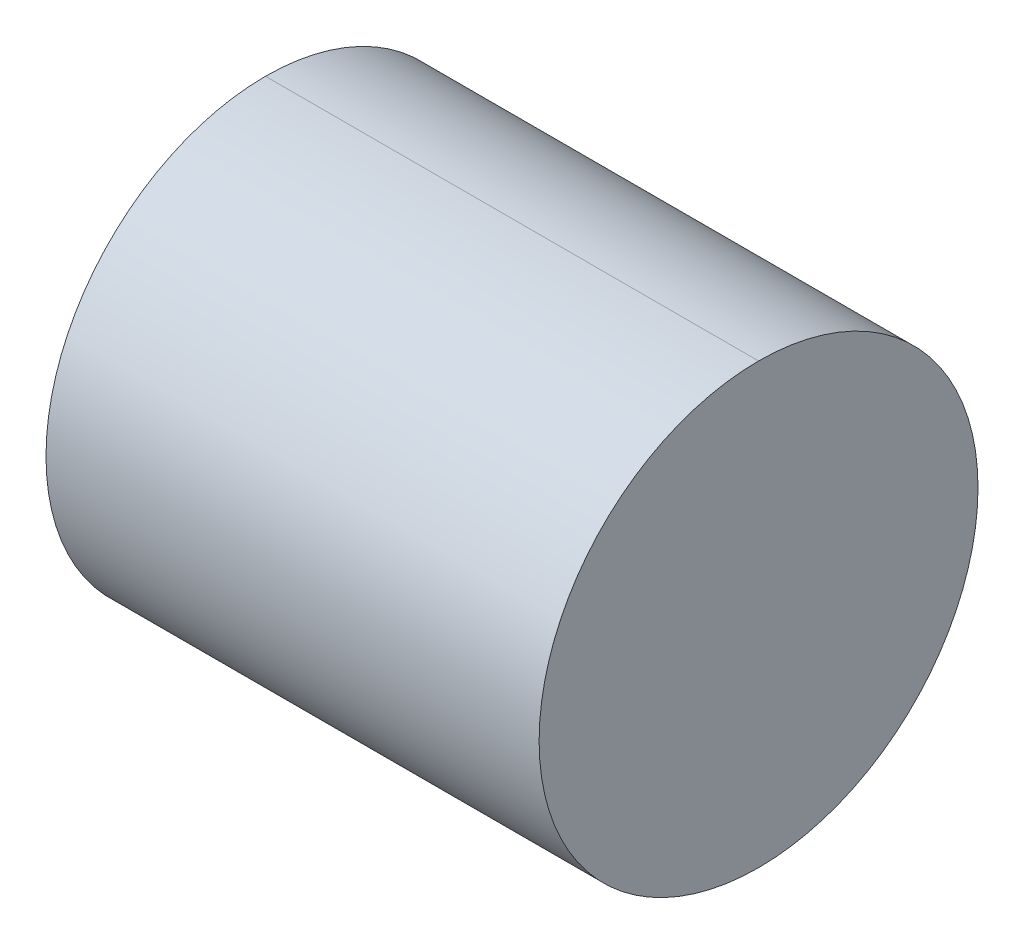
ISO-10303-21;
HEADER;
FILE_DESCRIPTION(('STEP AP214'),'2;1');
FILE_NAME('part.step','',(''),(''),'','','');
FILE_SCHEMA(('AUTOMOTIVE_DESIGN { 1 0 10303 214 1 1 1 1 }'));
ENDSEC;
DATA;
#1=APPLICATION_CONTEXT('core data for automotive mechanical design processes');
#2=APPLICATION_PROTOCOL_DEFINITION('international standard','automotive_design',2000,#1);
#3=PRODUCT_CONTEXT('',#1,'mechanical');
#4=PRODUCT('Part','Part','',(#3));
#5=PRODUCT_RELATED_PRODUCT_CATEGORY('part','',(#4));
#6=PRODUCT_DEFINITION_FORMATION('','',#4);
#7=PRODUCT_DEFINITION_CONTEXT('part definition',#1,'design');
#8=PRODUCT_DEFINITION('design','',#6,#7);
#9=PRODUCT_DEFINITION_SHAPE('','',#8);
#10=(LENGTH_UNIT() NAMED_UNIT(*) SI_UNIT(.MILLI.,.METRE.));
#11=(NAMED_UNIT(*) PLANE_ANGLE_UNIT() SI_UNIT($,.RADIAN.));
#12=(NAMED_UNIT(*) SI_UNIT($,.STERADIAN.) SOLID_ANGLE_UNIT());
#13=UNCERTAINTY_MEASURE_WITH_UNIT(LENGTH_MEASURE(1.E-05),#10,'distance_accuracy_value','');
#14=(GEOMETRIC_REPRESENTATION_CONTEXT(3) GLOBAL_UNCERTAINTY_ASSIGNED_CONTEXT((#13)) GLOBAL_UNIT_ASSIGNED_CONTEXT((#10,
#11,#12)) REPRESENTATION_CONTEXT('',''));
#15=CARTESIAN_POINT('',(0.,0.,0.));
#16=DIRECTION('',(0.,0.,1.));
#17=DIRECTION('',(1.,0.,0.));
#18=AXIS2_PLACEMENT_3D('',#15,#16,#17);
#19=CARTESIAN_POINT('',(5.,0.,0.));
#20=DIRECTION('',(1.,0.,0.));
#21=DIRECTION('',(0.,1.,0.));
#22=AXIS2_PLACEMENT_3D('',#19,#20,#21);
#23=PLANE('',#22);
#24=CARTESIAN_POINT('',(5.,0.,0.));
#25=DIRECTION('',(1.,0.,0.));
#26=DIRECTION('',(0.,1.,0.));
#27=AXIS2_PLACEMENT_3D('',#24,#25,#26);
#28=CIRCLE('',#27,2.225);
#29=CARTESIAN_POINT('',(5.,2.225,0.));
#30=VERTEX_POINT('',#29);
#31=CARTESIAN_POINT('',(5.,-2.225,0.));
#32=VERTEX_POINT('',#31);
#33=EDGE_CURVE('E59',#30,#32,#28,.T.);
#34=ORIENTED_EDGE('',*,*,#33,.T.);
#35=CARTESIAN_POINT('',(5.,0.,0.));
#36=DIRECTION('',(1.,0.,0.));
#37=DIRECTION('',(0.,1.,0.));
#38=AXIS2_PLACEMENT_3D('',#35,#36,#37);
#39=CIRCLE('',#38,2.225);
#40=EDGE_CURVE('E11',#32,#30,#39,.T.);
#41=ORIENTED_EDGE('',*,*,#40,.T.);
#42=EDGE_LOOP('',(#34,#41));
#43=FACE_BOUND('',#42,.T.);
#44=ADVANCED_FACE('F16',(#43),#23,.T.);
#45=CARTESIAN_POINT('',(0.,0.,0.));
#46=DIRECTION('',(1.,0.,0.));
#47=DIRECTION('',(0.,1.,0.));
#48=AXIS2_PLACEMENT_3D('',#45,#46,#47);
#49=PLANE('',#48);
#50=CARTESIAN_POINT('',(0.,0.,0.));
#51=DIRECTION('',(1.,0.,0.));
#52=DIRECTION('',(0.,1.,0.));
#53=AXIS2_PLACEMENT_3D('',#50,#51,#52);
#54=CIRCLE('',#53,2.225);
#55=CARTESIAN_POINT('',(0.,-2.225,0.));
#56=VERTEX_POINT('',#55);
#57=CARTESIAN_POINT('',(0.,2.225,0.));
#58=VERTEX_POINT('',#57);
#59=EDGE_CURVE('E26',#56,#58,#54,.T.);
#60=ORIENTED_EDGE('',*,*,#59,.F.);
#61=CARTESIAN_POINT('',(0.,0.,0.));
#62=DIRECTION('',(1.,0.,0.));
#63=DIRECTION('',(0.,1.,0.));
#64=AXIS2_PLACEMENT_3D('',#61,#62,#63);
#65=CIRCLE('',#64,2.225);
#66=EDGE_CURVE('E19',#58,#56,#65,.T.);
#67=ORIENTED_EDGE('',*,*,#66,.F.);
#68=EDGE_LOOP('',(#60,#67));
#69=FACE_BOUND('',#68,.T.);
#70=ADVANCED_FACE('F61',(#69),#49,.F.);
#71=CARTESIAN_POINT('',(2.5,0.,0.));
#72=DIRECTION('',(1.,0.,0.));
#73=DIRECTION('',(0.,1.,0.));
#74=AXIS2_PLACEMENT_3D('',#71,#72,#73);
#75=CYLINDRICAL_SURFACE('',#74,2.225);
#76=DIRECTION('',(1.,0.,0.));
#77=VECTOR('',#76,1.);
#78=CARTESIAN_POINT('',(2.5,-2.225,0.));
#79=LINE('',#78,#77);
#80=EDGE_CURVE('E55',#56,#32,#79,.T.);
#81=ORIENTED_EDGE('',*,*,#80,.F.);
#82=ORIENTED_EDGE('',*,*,#59,.T.);
#83=DIRECTION('',(1.,0.,0.));
#84=VECTOR('',#83,1.);
#85=CARTESIAN_POINT('',(2.5,2.225,0.));
#86=LINE('',#85,#84);
#87=EDGE_CURVE('E53',#58,#30,#86,.T.);
#88=ORIENTED_EDGE('',*,*,#87,.T.);
#89=ORIENTED_EDGE('',*,*,#40,.F.);
#90=EDGE_LOOP('',(#81,#82,#88,#89));
#91=FACE_BOUND('',#90,.T.);
#92=ADVANCED_FACE('F51',(#91),#75,.T.);
#93=CARTESIAN_POINT('',(2.5,0.,0.));
#94=DIRECTION('',(1.,0.,0.));
#95=DIRECTION('',(0.,1.,0.));
#96=AXIS2_PLACEMENT_3D('',#93,#94,#95);
#97=CYLINDRICAL_SURFACE('',#96,2.225);
#98=ORIENTED_EDGE('',*,*,#87,.F.);
#99=ORIENTED_EDGE('',*,*,#66,.T.);
#100=ORIENTED_EDGE('',*,*,#80,.T.);
#101=ORIENTED_EDGE('',*,*,#33,.F.);
#102=EDGE_LOOP('',(#98,#99,#100,#101));
#103=FACE_BOUND('',#102,.T.);
#104=ADVANCED_FACE('F64',(#103),#97,.T.);
#105=CLOSED_SHELL('',(#44,#70,#92,#104));
#106=MANIFOLD_SOLID_BREP('B1',#105);
#107=ADVANCED_BREP_SHAPE_REPRESENTATION('',(#18,#106),#14);
#108=SHAPE_DEFINITION_REPRESENTATION(#9,#107);
ENDSEC;
END-ISO-10303-21;
